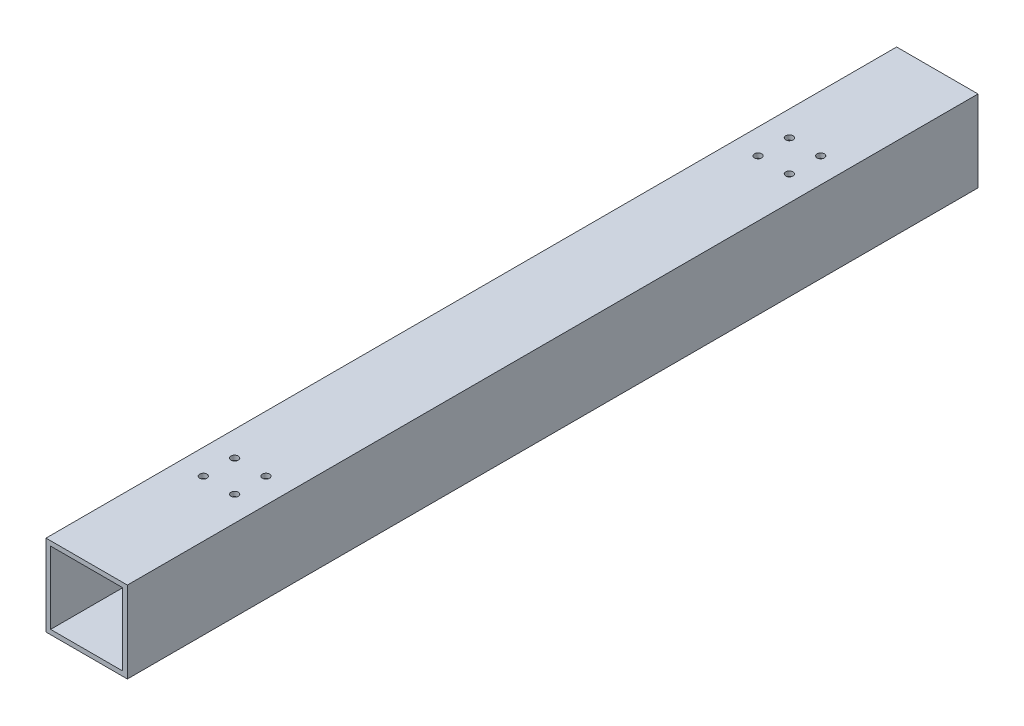
ISO-10303-21;
HEADER;
FILE_DESCRIPTION(('STEP AP214'),'2;1');
FILE_NAME('part.step','',(''),(''),'','','');
FILE_SCHEMA(('AUTOMOTIVE_DESIGN { 1 0 10303 214 1 1 1 1 }'));
ENDSEC;
DATA;
#1=APPLICATION_CONTEXT('core data for automotive mechanical design processes');
#2=APPLICATION_PROTOCOL_DEFINITION('international standard','automotive_design',2000,#1);
#3=PRODUCT_CONTEXT('',#1,'mechanical');
#4=PRODUCT('Part','Part','',(#3));
#5=PRODUCT_RELATED_PRODUCT_CATEGORY('part','',(#4));
#6=PRODUCT_DEFINITION_FORMATION('','',#4);
#7=PRODUCT_DEFINITION_CONTEXT('part definition',#1,'design');
#8=PRODUCT_DEFINITION('design','',#6,#7);
#9=PRODUCT_DEFINITION_SHAPE('','',#8);
#10=(LENGTH_UNIT() NAMED_UNIT(*) SI_UNIT(.MILLI.,.METRE.));
#11=(NAMED_UNIT(*) PLANE_ANGLE_UNIT() SI_UNIT($,.RADIAN.));
#12=(NAMED_UNIT(*) SI_UNIT($,.STERADIAN.) SOLID_ANGLE_UNIT());
#13=UNCERTAINTY_MEASURE_WITH_UNIT(LENGTH_MEASURE(1.E-05),#10,'distance_accuracy_value','');
#14=(GEOMETRIC_REPRESENTATION_CONTEXT(3) GLOBAL_UNCERTAINTY_ASSIGNED_CONTEXT((#13)) GLOBAL_UNIT_ASSIGNED_CONTEXT((#10,
#11,#12)) REPRESENTATION_CONTEXT('',''));
#15=CARTESIAN_POINT('',(0.,0.,0.));
#16=DIRECTION('',(0.,0.,1.));
#17=DIRECTION('',(1.,0.,0.));
#18=AXIS2_PLACEMENT_3D('',#15,#16,#17);
#19=CARTESIAN_POINT('',(0.,0.,182.5625));
#20=DIRECTION('',(0.,0.,-1.));
#21=DIRECTION('',(-1.,0.,0.));
#22=AXIS2_PLACEMENT_3D('',#19,#20,#21);
#23=PLANE('',#22);
#24=DIRECTION('',(0.,1.,0.));
#25=VECTOR('',#24,1.);
#26=CARTESIAN_POINT('',(17.4625,-17.4625,182.5625));
#27=LINE('',#26,#25);
#28=CARTESIAN_POINT('',(17.4625,-17.4625,182.5625));
#29=VERTEX_POINT('',#28);
#30=CARTESIAN_POINT('',(17.4625,17.4625,182.5625));
#31=VERTEX_POINT('',#30);
#32=EDGE_CURVE('E138',#29,#31,#27,.T.);
#33=ORIENTED_EDGE('',*,*,#32,.T.);
#34=DIRECTION('',(-1.,0.,0.));
#35=VECTOR('',#34,1.);
#36=CARTESIAN_POINT('',(-17.4625,17.4625,182.5625));
#37=LINE('',#36,#35);
#38=CARTESIAN_POINT('',(-17.4625,17.4625,182.5625));
#39=VERTEX_POINT('',#38);
#40=EDGE_CURVE('E141',#31,#39,#37,.T.);
#41=ORIENTED_EDGE('',*,*,#40,.T.);
#42=DIRECTION('',(0.,-1.,0.));
#43=VECTOR('',#42,1.);
#44=CARTESIAN_POINT('',(-17.4625,-17.4625,182.5625));
#45=LINE('',#44,#43);
#46=CARTESIAN_POINT('',(-17.4625,-17.4625,182.5625));
#47=VERTEX_POINT('',#46);
#48=EDGE_CURVE('E144',#39,#47,#45,.T.);
#49=ORIENTED_EDGE('',*,*,#48,.T.);
#50=DIRECTION('',(1.,0.,0.));
#51=VECTOR('',#50,1.);
#52=CARTESIAN_POINT('',(-17.4625,-17.4625,182.5625));
#53=LINE('',#52,#51);
#54=EDGE_CURVE('E146',#47,#29,#53,.T.);
#55=ORIENTED_EDGE('',*,*,#54,.T.);
#56=EDGE_LOOP('',(#33,#41,#49,#55));
#57=FACE_BOUND('',#56,.T.);
#58=DIRECTION('',(0.,1.,0.));
#59=VECTOR('',#58,1.);
#60=CARTESIAN_POINT('',(15.4813,-15.4813,182.5625));
#61=LINE('',#60,#59);
#62=CARTESIAN_POINT('',(15.4813,-15.4813,182.5625));
#63=VERTEX_POINT('',#62);
#64=CARTESIAN_POINT('',(15.4813,15.4813,182.5625));
#65=VERTEX_POINT('',#64);
#66=EDGE_CURVE('E100',#63,#65,#61,.T.);
#67=ORIENTED_EDGE('',*,*,#66,.F.);
#68=DIRECTION('',(1.,0.,0.));
#69=VECTOR('',#68,1.);
#70=CARTESIAN_POINT('',(-15.4813,-15.4813,182.5625));
#71=LINE('',#70,#69);
#72=CARTESIAN_POINT('',(-15.4813,-15.4813,182.5625));
#73=VERTEX_POINT('',#72);
#74=EDGE_CURVE('E122',#73,#63,#71,.T.);
#75=ORIENTED_EDGE('',*,*,#74,.F.);
#76=DIRECTION('',(0.,-1.,0.));
#77=VECTOR('',#76,1.);
#78=CARTESIAN_POINT('',(-15.4813,-15.4813,182.5625));
#79=LINE('',#78,#77);
#80=CARTESIAN_POINT('',(-15.4813,15.4813,182.5625));
#81=VERTEX_POINT('',#80);
#82=EDGE_CURVE('E120',#81,#73,#79,.T.);
#83=ORIENTED_EDGE('',*,*,#82,.F.);
#84=DIRECTION('',(-1.,0.,0.));
#85=VECTOR('',#84,1.);
#86=CARTESIAN_POINT('',(-15.4813,15.4813,182.5625));
#87=LINE('',#86,#85);
#88=EDGE_CURVE('E108',#65,#81,#87,.T.);
#89=ORIENTED_EDGE('',*,*,#88,.F.);
#90=EDGE_LOOP('',(#67,#75,#83,#89));
#91=FACE_BOUND('',#90,.T.);
#92=ADVANCED_FACE('F33',(#57,#91),#23,.F.);
#93=CARTESIAN_POINT('',(0.,0.,-182.5625));
#94=DIRECTION('',(0.,0.,-1.));
#95=DIRECTION('',(-1.,0.,0.));
#96=AXIS2_PLACEMENT_3D('',#93,#94,#95);
#97=PLANE('',#96);
#98=DIRECTION('',(0.,1.,0.));
#99=VECTOR('',#98,1.);
#100=CARTESIAN_POINT('',(17.4625,-17.4625,-182.5625));
#101=LINE('',#100,#99);
#102=CARTESIAN_POINT('',(17.4625,-17.4625,-182.5625));
#103=VERTEX_POINT('',#102);
#104=CARTESIAN_POINT('',(17.4625,17.4625,-182.5625));
#105=VERTEX_POINT('',#104);
#106=EDGE_CURVE('E116',#103,#105,#101,.T.);
#107=ORIENTED_EDGE('',*,*,#106,.F.);
#108=DIRECTION('',(1.,0.,0.));
#109=VECTOR('',#108,1.);
#110=CARTESIAN_POINT('',(-17.4625,-17.4625,-182.5625));
#111=LINE('',#110,#109);
#112=CARTESIAN_POINT('',(-17.4625,-17.4625,-182.5625));
#113=VERTEX_POINT('',#112);
#114=EDGE_CURVE('E142',#113,#103,#111,.T.);
#115=ORIENTED_EDGE('',*,*,#114,.F.);
#116=DIRECTION('',(0.,-1.,0.));
#117=VECTOR('',#116,1.);
#118=CARTESIAN_POINT('',(-17.4625,-17.4625,-182.5625));
#119=LINE('',#118,#117);
#120=CARTESIAN_POINT('',(-17.4625,17.4625,-182.5625));
#121=VERTEX_POINT('',#120);
#122=EDGE_CURVE('E153',#121,#113,#119,.T.);
#123=ORIENTED_EDGE('',*,*,#122,.F.);
#124=DIRECTION('',(-1.,0.,0.));
#125=VECTOR('',#124,1.);
#126=CARTESIAN_POINT('',(-17.4625,17.4625,-182.5625));
#127=LINE('',#126,#125);
#128=EDGE_CURVE('E151',#105,#121,#127,.T.);
#129=ORIENTED_EDGE('',*,*,#128,.F.);
#130=EDGE_LOOP('',(#107,#115,#123,#129));
#131=FACE_BOUND('',#130,.T.);
#132=DIRECTION('',(1.,0.,0.));
#133=VECTOR('',#132,1.);
#134=CARTESIAN_POINT('',(-15.4813,-15.4813,-182.5625));
#135=LINE('',#134,#133);
#136=CARTESIAN_POINT('',(-15.4813,-15.4813,-182.5625));
#137=VERTEX_POINT('',#136);
#138=CARTESIAN_POINT('',(15.4813,-15.4813,-182.5625));
#139=VERTEX_POINT('',#138);
#140=EDGE_CURVE('E109',#137,#139,#135,.T.);
#141=ORIENTED_EDGE('',*,*,#140,.T.);
#142=DIRECTION('',(0.,1.,0.));
#143=VECTOR('',#142,1.);
#144=CARTESIAN_POINT('',(15.4813,-15.4813,-182.5625));
#145=LINE('',#144,#143);
#146=CARTESIAN_POINT('',(15.4813,15.4813,-182.5625));
#147=VERTEX_POINT('',#146);
#148=EDGE_CURVE('E58',#139,#147,#145,.T.);
#149=ORIENTED_EDGE('',*,*,#148,.T.);
#150=DIRECTION('',(-1.,0.,0.));
#151=VECTOR('',#150,1.);
#152=CARTESIAN_POINT('',(-15.4813,15.4813,-182.5625));
#153=LINE('',#152,#151);
#154=CARTESIAN_POINT('',(-15.4813,15.4813,-182.5625));
#155=VERTEX_POINT('',#154);
#156=EDGE_CURVE('E115',#147,#155,#153,.T.);
#157=ORIENTED_EDGE('',*,*,#156,.T.);
#158=DIRECTION('',(0.,-1.,0.));
#159=VECTOR('',#158,1.);
#160=CARTESIAN_POINT('',(-15.4813,-15.4813,-182.5625));
#161=LINE('',#160,#159);
#162=EDGE_CURVE('E130',#155,#137,#161,.T.);
#163=ORIENTED_EDGE('',*,*,#162,.T.);
#164=EDGE_LOOP('',(#141,#149,#157,#163));
#165=FACE_BOUND('',#164,.T.);
#166=ADVANCED_FACE('F229',(#131,#165),#97,.T.);
#167=CARTESIAN_POINT('',(17.4625,-17.4625,182.5625));
#168=DIRECTION('',(-1.,0.,0.));
#169=DIRECTION('',(0.,0.,1.));
#170=AXIS2_PLACEMENT_3D('',#167,#168,#169);
#171=PLANE('',#170);
#172=ORIENTED_EDGE('',*,*,#106,.T.);
#173=DIRECTION('',(0.,0.,-1.));
#174=VECTOR('',#173,1.);
#175=CARTESIAN_POINT('',(17.4625,17.4625,182.5625));
#176=LINE('',#175,#174);
#177=EDGE_CURVE('E11',#31,#105,#176,.T.);
#178=ORIENTED_EDGE('',*,*,#177,.F.);
#179=ORIENTED_EDGE('',*,*,#32,.F.);
#180=DIRECTION('',(0.,0.,-1.));
#181=VECTOR('',#180,1.);
#182=CARTESIAN_POINT('',(17.4625,-17.4625,182.5625));
#183=LINE('',#182,#181);
#184=EDGE_CURVE('E148',#29,#103,#183,.T.);
#185=ORIENTED_EDGE('',*,*,#184,.T.);
#186=EDGE_LOOP('',(#172,#178,#179,#185));
#187=FACE_BOUND('',#186,.T.);
#188=ADVANCED_FACE('F35',(#187),#171,.F.);
#189=CARTESIAN_POINT('',(-17.4625,17.4625,182.5625));
#190=DIRECTION('',(0.,-1.,0.));
#191=DIRECTION('',(0.,0.,-1.));
#192=AXIS2_PLACEMENT_3D('',#189,#190,#191);
#193=PLANE('',#192);
#194=CARTESIAN_POINT('',(-6.71751442127231,17.4625,112.344985578728));
#195=DIRECTION('',(0.,1.,0.));
#196=DIRECTION('',(0.,0.,-1.));
#197=AXIS2_PLACEMENT_3D('',#194,#195,#196);
#198=CIRCLE('',#197,1.56250004999999);
#199=CARTESIAN_POINT('',(-6.71751442127231,17.4625,110.782485528728));
#200=VERTEX_POINT('',#199);
#201=EDGE_CURVE('E265',#200,#200,#198,.T.);
#202=ORIENTED_EDGE('',*,*,#201,.F.);
#203=EDGE_LOOP('',(#202));
#204=FACE_BOUND('',#203,.T.);
#205=CARTESIAN_POINT('',(-6.7175144212723,17.4625,-112.344985578728));
#206=DIRECTION('',(0.,1.,0.));
#207=DIRECTION('',(0.,0.,1.));
#208=AXIS2_PLACEMENT_3D('',#205,#206,#207);
#209=CIRCLE('',#208,1.56250005);
#210=CARTESIAN_POINT('',(-6.7175144212723,17.4625,-110.782485528728));
#211=VERTEX_POINT('',#210);
#212=EDGE_CURVE('E269',#211,#211,#209,.T.);
#213=ORIENTED_EDGE('',*,*,#212,.F.);
#214=EDGE_LOOP('',(#213));
#215=FACE_BOUND('',#214,.T.);
#216=CARTESIAN_POINT('',(6.71751442127208,17.4625,-112.344985578728));
#217=DIRECTION('',(0.,1.,0.));
#218=DIRECTION('',(0.,0.,1.));
#219=AXIS2_PLACEMENT_3D('',#216,#217,#218);
#220=CIRCLE('',#219,1.56250005000001);
#221=CARTESIAN_POINT('',(6.71751442127208,17.4625,-110.782485528728));
#222=VERTEX_POINT('',#221);
#223=EDGE_CURVE('E273',#222,#222,#220,.T.);
#224=ORIENTED_EDGE('',*,*,#223,.F.);
#225=EDGE_LOOP('',(#224));
#226=FACE_BOUND('',#225,.T.);
#227=CARTESIAN_POINT('',(-6.7175144212724,17.4625,-125.780014421272));
#228=DIRECTION('',(0.,1.,0.));
#229=DIRECTION('',(0.,0.,1.));
#230=AXIS2_PLACEMENT_3D('',#227,#228,#229);
#231=CIRCLE('',#230,1.56250005000002);
#232=CARTESIAN_POINT('',(-6.7175144212724,17.4625,-124.217514371272));
#233=VERTEX_POINT('',#232);
#234=EDGE_CURVE('E277',#233,#233,#231,.T.);
#235=ORIENTED_EDGE('',*,*,#234,.F.);
#236=EDGE_LOOP('',(#235));
#237=FACE_BOUND('',#236,.T.);
#238=CARTESIAN_POINT('',(6.71751442127208,17.4625,112.344985578728));
#239=DIRECTION('',(0.,1.,0.));
#240=DIRECTION('',(0.,0.,-1.));
#241=AXIS2_PLACEMENT_3D('',#238,#239,#240);
#242=CIRCLE('',#241,1.56250005000001);
#243=CARTESIAN_POINT('',(6.71751442127208,17.4625,110.782485528728));
#244=VERTEX_POINT('',#243);
#245=EDGE_CURVE('E281',#244,#244,#242,.T.);
#246=ORIENTED_EDGE('',*,*,#245,.F.);
#247=EDGE_LOOP('',(#246));
#248=FACE_BOUND('',#247,.T.);
#249=CARTESIAN_POINT('',(6.71751442127203,17.4625,125.780014421272));
#250=DIRECTION('',(0.,1.,0.));
#251=DIRECTION('',(0.,0.,-1.));
#252=AXIS2_PLACEMENT_3D('',#249,#250,#251);
#253=CIRCLE('',#252,1.56250004999998);
#254=CARTESIAN_POINT('',(6.71751442127203,17.4625,124.217514371272));
#255=VERTEX_POINT('',#254);
#256=EDGE_CURVE('E285',#255,#255,#253,.T.);
#257=ORIENTED_EDGE('',*,*,#256,.F.);
#258=EDGE_LOOP('',(#257));
#259=FACE_BOUND('',#258,.T.);
#260=CARTESIAN_POINT('',(-6.7175144212724,17.4625,125.780014421272));
#261=DIRECTION('',(0.,1.,0.));
#262=DIRECTION('',(0.,0.,-1.));
#263=AXIS2_PLACEMENT_3D('',#260,#261,#262);
#264=CIRCLE('',#263,1.56250005000002);
#265=CARTESIAN_POINT('',(-6.7175144212724,17.4625,124.217514371272));
#266=VERTEX_POINT('',#265);
#267=EDGE_CURVE('E289',#266,#266,#264,.T.);
#268=ORIENTED_EDGE('',*,*,#267,.F.);
#269=EDGE_LOOP('',(#268));
#270=FACE_BOUND('',#269,.T.);
#271=CARTESIAN_POINT('',(6.71751442127203,17.4625,-125.780014421272));
#272=DIRECTION('',(0.,1.,0.));
#273=DIRECTION('',(0.,0.,1.));
#274=AXIS2_PLACEMENT_3D('',#271,#272,#273);
#275=CIRCLE('',#274,1.56250004999999);
#276=CARTESIAN_POINT('',(6.71751442127203,17.4625,-124.217514371272));
#277=VERTEX_POINT('',#276);
#278=EDGE_CURVE('E293',#277,#277,#275,.T.);
#279=ORIENTED_EDGE('',*,*,#278,.F.);
#280=EDGE_LOOP('',(#279));
#281=FACE_BOUND('',#280,.T.);
#282=ORIENTED_EDGE('',*,*,#128,.T.);
#283=DIRECTION('',(0.,0.,-1.));
#284=VECTOR('',#283,1.);
#285=CARTESIAN_POINT('',(-17.4625,17.4625,182.5625));
#286=LINE('',#285,#284);
#287=EDGE_CURVE('E42',#39,#121,#286,.T.);
#288=ORIENTED_EDGE('',*,*,#287,.F.);
#289=ORIENTED_EDGE('',*,*,#40,.F.);
#290=ORIENTED_EDGE('',*,*,#177,.T.);
#291=EDGE_LOOP('',(#282,#288,#289,#290));
#292=FACE_BOUND('',#291,.T.);
#293=ADVANCED_FACE('F254',(#204,#215,#226,#237,#248,#259,#270,#281,#292),#193,.F.);
#294=CARTESIAN_POINT('',(-17.4625,-17.4625,182.5625));
#295=DIRECTION('',(1.,0.,0.));
#296=DIRECTION('',(0.,0.,-1.));
#297=AXIS2_PLACEMENT_3D('',#294,#295,#296);
#298=PLANE('',#297);
#299=ORIENTED_EDGE('',*,*,#122,.T.);
#300=DIRECTION('',(0.,0.,-1.));
#301=VECTOR('',#300,1.);
#302=CARTESIAN_POINT('',(-17.4625,-17.4625,182.5625));
#303=LINE('',#302,#301);
#304=EDGE_CURVE('E158',#47,#113,#303,.T.);
#305=ORIENTED_EDGE('',*,*,#304,.F.);
#306=ORIENTED_EDGE('',*,*,#48,.F.);
#307=ORIENTED_EDGE('',*,*,#287,.T.);
#308=EDGE_LOOP('',(#299,#305,#306,#307));
#309=FACE_BOUND('',#308,.T.);
#310=ADVANCED_FACE('F251',(#309),#298,.F.);
#311=CARTESIAN_POINT('',(-17.4625,-17.4625,182.5625));
#312=DIRECTION('',(0.,1.,0.));
#313=DIRECTION('',(0.,0.,1.));
#314=AXIS2_PLACEMENT_3D('',#311,#312,#313);
#315=PLANE('',#314);
#316=CARTESIAN_POINT('',(-6.71751442127231,-17.4625,112.344985578728));
#317=DIRECTION('',(0.,1.,0.));
#318=DIRECTION('',(0.,0.,-1.));
#319=AXIS2_PLACEMENT_3D('',#316,#317,#318);
#320=CIRCLE('',#319,1.56250004999999);
#321=CARTESIAN_POINT('',(-6.71751442127231,-17.4625,110.782485528728));
#322=VERTEX_POINT('',#321);
#323=EDGE_CURVE('E397',#322,#322,#320,.T.);
#324=ORIENTED_EDGE('',*,*,#323,.T.);
#325=EDGE_LOOP('',(#324));
#326=FACE_BOUND('',#325,.T.);
#327=CARTESIAN_POINT('',(-6.7175144212723,-17.4625,-112.344985578728));
#328=DIRECTION('',(0.,1.,0.));
#329=DIRECTION('',(0.,0.,1.));
#330=AXIS2_PLACEMENT_3D('',#327,#328,#329);
#331=CIRCLE('',#330,1.56250005);
#332=CARTESIAN_POINT('',(-6.7175144212723,-17.4625,-110.782485528728));
#333=VERTEX_POINT('',#332);
#334=EDGE_CURVE('E391',#333,#333,#331,.T.);
#335=ORIENTED_EDGE('',*,*,#334,.T.);
#336=EDGE_LOOP('',(#335));
#337=FACE_BOUND('',#336,.T.);
#338=CARTESIAN_POINT('',(6.71751442127208,-17.4625,-112.344985578728));
#339=DIRECTION('',(0.,1.,0.));
#340=DIRECTION('',(0.,0.,1.));
#341=AXIS2_PLACEMENT_3D('',#338,#339,#340);
#342=CIRCLE('',#341,1.56250005000001);
#343=CARTESIAN_POINT('',(6.71751442127208,-17.4625,-110.782485528728));
#344=VERTEX_POINT('',#343);
#345=EDGE_CURVE('E313',#344,#344,#342,.T.);
#346=ORIENTED_EDGE('',*,*,#345,.T.);
#347=EDGE_LOOP('',(#346));
#348=FACE_BOUND('',#347,.T.);
#349=CARTESIAN_POINT('',(-6.7175144212724,-17.4625,-125.780014421272));
#350=DIRECTION('',(0.,1.,0.));
#351=DIRECTION('',(0.,0.,1.));
#352=AXIS2_PLACEMENT_3D('',#349,#350,#351);
#353=CIRCLE('',#352,1.56250005000002);
#354=CARTESIAN_POINT('',(-6.7175144212724,-17.4625,-124.217514371272));
#355=VERTEX_POINT('',#354);
#356=EDGE_CURVE('E306',#355,#355,#353,.T.);
#357=ORIENTED_EDGE('',*,*,#356,.T.);
#358=EDGE_LOOP('',(#357));
#359=FACE_BOUND('',#358,.T.);
#360=CARTESIAN_POINT('',(6.71751442127208,-17.4625,112.344985578728));
#361=DIRECTION('',(0.,1.,0.));
#362=DIRECTION('',(0.,0.,-1.));
#363=AXIS2_PLACEMENT_3D('',#360,#361,#362);
#364=CIRCLE('',#363,1.56250005000001);
#365=CARTESIAN_POINT('',(6.71751442127208,-17.4625,110.782485528728));
#366=VERTEX_POINT('',#365);
#367=EDGE_CURVE('E400',#366,#366,#364,.T.);
#368=ORIENTED_EDGE('',*,*,#367,.T.);
#369=EDGE_LOOP('',(#368));
#370=FACE_BOUND('',#369,.T.);
#371=CARTESIAN_POINT('',(6.71751442127203,-17.4625,125.780014421272));
#372=DIRECTION('',(0.,1.,0.));
#373=DIRECTION('',(0.,0.,-1.));
#374=AXIS2_PLACEMENT_3D('',#371,#372,#373);
#375=CIRCLE('',#374,1.56250004999998);
#376=CARTESIAN_POINT('',(6.71751442127203,-17.4625,124.217514371272));
#377=VERTEX_POINT('',#376);
#378=EDGE_CURVE('E407',#377,#377,#375,.T.);
#379=ORIENTED_EDGE('',*,*,#378,.T.);
#380=EDGE_LOOP('',(#379));
#381=FACE_BOUND('',#380,.T.);
#382=CARTESIAN_POINT('',(-6.7175144212724,-17.4625,125.780014421272));
#383=DIRECTION('',(0.,1.,0.));
#384=DIRECTION('',(0.,0.,-1.));
#385=AXIS2_PLACEMENT_3D('',#382,#383,#384);
#386=CIRCLE('',#385,1.56250005000002);
#387=CARTESIAN_POINT('',(-6.7175144212724,-17.4625,124.217514371272));
#388=VERTEX_POINT('',#387);
#389=EDGE_CURVE('E403',#388,#388,#386,.T.);
#390=ORIENTED_EDGE('',*,*,#389,.T.);
#391=EDGE_LOOP('',(#390));
#392=FACE_BOUND('',#391,.T.);
#393=CARTESIAN_POINT('',(6.71751442127203,-17.4625,-125.780014421272));
#394=DIRECTION('',(0.,1.,0.));
#395=DIRECTION('',(0.,0.,1.));
#396=AXIS2_PLACEMENT_3D('',#393,#394,#395);
#397=CIRCLE('',#396,1.56250004999999);
#398=CARTESIAN_POINT('',(6.71751442127203,-17.4625,-124.217514371272));
#399=VERTEX_POINT('',#398);
#400=EDGE_CURVE('E167',#399,#399,#397,.T.);
#401=ORIENTED_EDGE('',*,*,#400,.T.);
#402=EDGE_LOOP('',(#401));
#403=FACE_BOUND('',#402,.T.);
#404=ORIENTED_EDGE('',*,*,#114,.T.);
#405=ORIENTED_EDGE('',*,*,#184,.F.);
#406=ORIENTED_EDGE('',*,*,#54,.F.);
#407=ORIENTED_EDGE('',*,*,#304,.T.);
#408=EDGE_LOOP('',(#404,#405,#406,#407));
#409=FACE_BOUND('',#408,.T.);
#410=ADVANCED_FACE('F248',(#326,#337,#348,#359,#370,#381,#392,#403,#409),#315,.F.);
#411=CARTESIAN_POINT('',(15.4813,-15.4813,182.5625));
#412=DIRECTION('',(-1.,0.,0.));
#413=DIRECTION('',(0.,0.,1.));
#414=AXIS2_PLACEMENT_3D('',#411,#412,#413);
#415=PLANE('',#414);
#416=ORIENTED_EDGE('',*,*,#148,.F.);
#417=DIRECTION('',(0.,0.,-1.));
#418=VECTOR('',#417,1.);
#419=CARTESIAN_POINT('',(15.4813,-15.4813,182.5625));
#420=LINE('',#419,#418);
#421=EDGE_CURVE('E104',#63,#139,#420,.T.);
#422=ORIENTED_EDGE('',*,*,#421,.F.);
#423=ORIENTED_EDGE('',*,*,#66,.T.);
#424=DIRECTION('',(0.,0.,-1.));
#425=VECTOR('',#424,1.);
#426=CARTESIAN_POINT('',(15.4813,15.4813,182.5625));
#427=LINE('',#426,#425);
#428=EDGE_CURVE('E103',#65,#147,#427,.T.);
#429=ORIENTED_EDGE('',*,*,#428,.T.);
#430=EDGE_LOOP('',(#416,#422,#423,#429));
#431=FACE_BOUND('',#430,.T.);
#432=ADVANCED_FACE('F102',(#431),#415,.T.);
#433=CARTESIAN_POINT('',(-15.4813,15.4813,182.5625));
#434=DIRECTION('',(0.,-1.,0.));
#435=DIRECTION('',(1.,0.,0.));
#436=AXIS2_PLACEMENT_3D('',#433,#434,#435);
#437=PLANE('',#436);
#438=CARTESIAN_POINT('',(-6.71751442127231,15.4813,112.344985578728));
#439=DIRECTION('',(0.,-1.,0.));
#440=DIRECTION('',(1.,0.,0.));
#441=AXIS2_PLACEMENT_3D('',#438,#439,#440);
#442=CIRCLE('',#441,1.56250004999999);
#443=CARTESIAN_POINT('',(-5.15501437127231,15.4813,112.344985578728));
#444=VERTEX_POINT('',#443);
#445=EDGE_CURVE('E128',#444,#444,#442,.T.);
#446=ORIENTED_EDGE('',*,*,#445,.F.);
#447=EDGE_LOOP('',(#446));
#448=FACE_BOUND('',#447,.T.);
#449=CARTESIAN_POINT('',(-6.7175144212723,15.4813,-112.344985578728));
#450=DIRECTION('',(0.,-1.,0.));
#451=DIRECTION('',(1.,0.,0.));
#452=AXIS2_PLACEMENT_3D('',#449,#450,#451);
#453=CIRCLE('',#452,1.56250005);
#454=CARTESIAN_POINT('',(-5.15501437127231,15.4813,-112.344985578728));
#455=VERTEX_POINT('',#454);
#456=EDGE_CURVE('E189',#455,#455,#453,.T.);
#457=ORIENTED_EDGE('',*,*,#456,.F.);
#458=EDGE_LOOP('',(#457));
#459=FACE_BOUND('',#458,.T.);
#460=CARTESIAN_POINT('',(6.71751442127208,15.4813,-112.344985578728));
#461=DIRECTION('',(0.,-1.,0.));
#462=DIRECTION('',(1.,0.,0.));
#463=AXIS2_PLACEMENT_3D('',#460,#461,#462);
#464=CIRCLE('',#463,1.56250005000001);
#465=CARTESIAN_POINT('',(8.28001447127208,15.4813,-112.344985578728));
#466=VERTEX_POINT('',#465);
#467=EDGE_CURVE('E186',#466,#466,#464,.T.);
#468=ORIENTED_EDGE('',*,*,#467,.F.);
#469=EDGE_LOOP('',(#468));
#470=FACE_BOUND('',#469,.T.);
#471=CARTESIAN_POINT('',(-6.7175144212724,15.4813,-125.780014421272));
#472=DIRECTION('',(0.,-1.,0.));
#473=DIRECTION('',(1.,0.,0.));
#474=AXIS2_PLACEMENT_3D('',#471,#472,#473);
#475=CIRCLE('',#474,1.56250005000002);
#476=CARTESIAN_POINT('',(-5.15501437127238,15.4813,-125.780014421272));
#477=VERTEX_POINT('',#476);
#478=EDGE_CURVE('E183',#477,#477,#475,.T.);
#479=ORIENTED_EDGE('',*,*,#478,.F.);
#480=EDGE_LOOP('',(#479));
#481=FACE_BOUND('',#480,.T.);
#482=CARTESIAN_POINT('',(6.71751442127208,15.4813,112.344985578728));
#483=DIRECTION('',(0.,-1.,0.));
#484=DIRECTION('',(1.,0.,0.));
#485=AXIS2_PLACEMENT_3D('',#482,#483,#484);
#486=CIRCLE('',#485,1.56250005000001);
#487=CARTESIAN_POINT('',(8.28001447127209,15.4813,112.344985578728));
#488=VERTEX_POINT('',#487);
#489=EDGE_CURVE('E179',#488,#488,#486,.T.);
#490=ORIENTED_EDGE('',*,*,#489,.F.);
#491=EDGE_LOOP('',(#490));
#492=FACE_BOUND('',#491,.T.);
#493=CARTESIAN_POINT('',(6.71751442127203,15.4813,125.780014421272));
#494=DIRECTION('',(0.,-1.,0.));
#495=DIRECTION('',(1.,0.,0.));
#496=AXIS2_PLACEMENT_3D('',#493,#494,#495);
#497=CIRCLE('',#496,1.56250004999998);
#498=CARTESIAN_POINT('',(8.28001447127201,15.4813,125.780014421272));
#499=VERTEX_POINT('',#498);
#500=EDGE_CURVE('E175',#499,#499,#497,.T.);
#501=ORIENTED_EDGE('',*,*,#500,.F.);
#502=EDGE_LOOP('',(#501));
#503=FACE_BOUND('',#502,.T.);
#504=CARTESIAN_POINT('',(-6.7175144212724,15.4813,125.780014421272));
#505=DIRECTION('',(0.,-1.,0.));
#506=DIRECTION('',(1.,0.,0.));
#507=AXIS2_PLACEMENT_3D('',#504,#505,#506);
#508=CIRCLE('',#507,1.56250005000002);
#509=CARTESIAN_POINT('',(-5.15501437127238,15.4813,125.780014421272));
#510=VERTEX_POINT('',#509);
#511=EDGE_CURVE('E171',#510,#510,#508,.T.);
#512=ORIENTED_EDGE('',*,*,#511,.F.);
#513=EDGE_LOOP('',(#512));
#514=FACE_BOUND('',#513,.T.);
#515=CARTESIAN_POINT('',(6.71751442127203,15.4813,-125.780014421272));
#516=DIRECTION('',(0.,-1.,0.));
#517=DIRECTION('',(1.,0.,0.));
#518=AXIS2_PLACEMENT_3D('',#515,#516,#517);
#519=CIRCLE('',#518,1.56250004999999);
#520=CARTESIAN_POINT('',(8.28001447127201,15.4813,-125.780014421272));
#521=VERTEX_POINT('',#520);
#522=EDGE_CURVE('E166',#521,#521,#519,.T.);
#523=ORIENTED_EDGE('',*,*,#522,.F.);
#524=EDGE_LOOP('',(#523));
#525=FACE_BOUND('',#524,.T.);
#526=ORIENTED_EDGE('',*,*,#156,.F.);
#527=ORIENTED_EDGE('',*,*,#428,.F.);
#528=ORIENTED_EDGE('',*,*,#88,.T.);
#529=DIRECTION('',(0.,0.,-1.));
#530=VECTOR('',#529,1.);
#531=CARTESIAN_POINT('',(-15.4813,15.4813,182.5625));
#532=LINE('',#531,#530);
#533=EDGE_CURVE('E117',#81,#155,#532,.T.);
#534=ORIENTED_EDGE('',*,*,#533,.T.);
#535=EDGE_LOOP('',(#526,#527,#528,#534));
#536=FACE_BOUND('',#535,.T.);
#537=ADVANCED_FACE('F112',(#448,#459,#470,#481,#492,#503,#514,#525,#536),#437,.T.);
#538=CARTESIAN_POINT('',(-15.4813,-15.4813,182.5625));
#539=DIRECTION('',(1.,0.,0.));
#540=DIRECTION('',(0.,0.,-1.));
#541=AXIS2_PLACEMENT_3D('',#538,#539,#540);
#542=PLANE('',#541);
#543=ORIENTED_EDGE('',*,*,#162,.F.);
#544=ORIENTED_EDGE('',*,*,#533,.F.);
#545=ORIENTED_EDGE('',*,*,#82,.T.);
#546=DIRECTION('',(0.,0.,-1.));
#547=VECTOR('',#546,1.);
#548=CARTESIAN_POINT('',(-15.4813,-15.4813,182.5625));
#549=LINE('',#548,#547);
#550=EDGE_CURVE('E50',#73,#137,#549,.T.);
#551=ORIENTED_EDGE('',*,*,#550,.T.);
#552=EDGE_LOOP('',(#543,#544,#545,#551));
#553=FACE_BOUND('',#552,.T.);
#554=ADVANCED_FACE('F213',(#553),#542,.T.);
#555=CARTESIAN_POINT('',(-15.4813,-15.4813,182.5625));
#556=DIRECTION('',(0.,1.,0.));
#557=DIRECTION('',(0.,0.,1.));
#558=AXIS2_PLACEMENT_3D('',#555,#556,#557);
#559=PLANE('',#558);
#560=CARTESIAN_POINT('',(-6.71751442127231,-15.4813,112.344985578728));
#561=DIRECTION('',(0.,1.,0.));
#562=DIRECTION('',(0.,0.,1.));
#563=AXIS2_PLACEMENT_3D('',#560,#561,#562);
#564=CIRCLE('',#563,1.56250004999999);
#565=CARTESIAN_POINT('',(-6.71751442127231,-15.4813,113.907485628728));
#566=VERTEX_POINT('',#565);
#567=EDGE_CURVE('E37',#566,#566,#564,.T.);
#568=ORIENTED_EDGE('',*,*,#567,.F.);
#569=EDGE_LOOP('',(#568));
#570=FACE_BOUND('',#569,.T.);
#571=CARTESIAN_POINT('',(-6.7175144212723,-15.4813,-112.344985578728));
#572=DIRECTION('',(0.,1.,0.));
#573=DIRECTION('',(0.,0.,1.));
#574=AXIS2_PLACEMENT_3D('',#571,#572,#573);
#575=CIRCLE('',#574,1.56250005);
#576=CARTESIAN_POINT('',(-6.7175144212723,-15.4813,-110.782485528728));
#577=VERTEX_POINT('',#576);
#578=EDGE_CURVE('E187',#577,#577,#575,.T.);
#579=ORIENTED_EDGE('',*,*,#578,.F.);
#580=EDGE_LOOP('',(#579));
#581=FACE_BOUND('',#580,.T.);
#582=CARTESIAN_POINT('',(6.71751442127208,-15.4813,-112.344985578728));
#583=DIRECTION('',(0.,1.,0.));
#584=DIRECTION('',(0.,0.,1.));
#585=AXIS2_PLACEMENT_3D('',#582,#583,#584);
#586=CIRCLE('',#585,1.56250005000001);
#587=CARTESIAN_POINT('',(6.71751442127208,-15.4813,-110.782485528728));
#588=VERTEX_POINT('',#587);
#589=EDGE_CURVE('E184',#588,#588,#586,.T.);
#590=ORIENTED_EDGE('',*,*,#589,.F.);
#591=EDGE_LOOP('',(#590));
#592=FACE_BOUND('',#591,.T.);
#593=CARTESIAN_POINT('',(-6.7175144212724,-15.4813,-125.780014421272));
#594=DIRECTION('',(0.,1.,0.));
#595=DIRECTION('',(0.,0.,1.));
#596=AXIS2_PLACEMENT_3D('',#593,#594,#595);
#597=CIRCLE('',#596,1.56250005000002);
#598=CARTESIAN_POINT('',(-6.7175144212724,-15.4813,-124.217514371272));
#599=VERTEX_POINT('',#598);
#600=EDGE_CURVE('E180',#599,#599,#597,.T.);
#601=ORIENTED_EDGE('',*,*,#600,.F.);
#602=EDGE_LOOP('',(#601));
#603=FACE_BOUND('',#602,.T.);
#604=CARTESIAN_POINT('',(6.71751442127208,-15.4813,112.344985578728));
#605=DIRECTION('',(0.,1.,0.));
#606=DIRECTION('',(0.,0.,1.));
#607=AXIS2_PLACEMENT_3D('',#604,#605,#606);
#608=CIRCLE('',#607,1.56250005000001);
#609=CARTESIAN_POINT('',(6.71751442127208,-15.4813,113.907485628728));
#610=VERTEX_POINT('',#609);
#611=EDGE_CURVE('E176',#610,#610,#608,.T.);
#612=ORIENTED_EDGE('',*,*,#611,.F.);
#613=EDGE_LOOP('',(#612));
#614=FACE_BOUND('',#613,.T.);
#615=CARTESIAN_POINT('',(6.71751442127203,-15.4813,125.780014421272));
#616=DIRECTION('',(0.,1.,0.));
#617=DIRECTION('',(0.,0.,1.));
#618=AXIS2_PLACEMENT_3D('',#615,#616,#617);
#619=CIRCLE('',#618,1.56250004999998);
#620=CARTESIAN_POINT('',(6.71751442127203,-15.4813,127.342514471272));
#621=VERTEX_POINT('',#620);
#622=EDGE_CURVE('E172',#621,#621,#619,.T.);
#623=ORIENTED_EDGE('',*,*,#622,.F.);
#624=EDGE_LOOP('',(#623));
#625=FACE_BOUND('',#624,.T.);
#626=CARTESIAN_POINT('',(-6.7175144212724,-15.4813,125.780014421272));
#627=DIRECTION('',(0.,1.,0.));
#628=DIRECTION('',(0.,0.,1.));
#629=AXIS2_PLACEMENT_3D('',#626,#627,#628);
#630=CIRCLE('',#629,1.56250005000002);
#631=CARTESIAN_POINT('',(-6.7175144212724,-15.4813,127.342514471272));
#632=VERTEX_POINT('',#631);
#633=EDGE_CURVE('E168',#632,#632,#630,.T.);
#634=ORIENTED_EDGE('',*,*,#633,.F.);
#635=EDGE_LOOP('',(#634));
#636=FACE_BOUND('',#635,.T.);
#637=CARTESIAN_POINT('',(6.71751442127203,-15.4813,-125.780014421272));
#638=DIRECTION('',(0.,1.,0.));
#639=DIRECTION('',(0.,0.,1.));
#640=AXIS2_PLACEMENT_3D('',#637,#638,#639);
#641=CIRCLE('',#640,1.56250004999999);
#642=CARTESIAN_POINT('',(6.71751442127203,-15.4813,-124.217514371272));
#643=VERTEX_POINT('',#642);
#644=EDGE_CURVE('E163',#643,#643,#641,.T.);
#645=ORIENTED_EDGE('',*,*,#644,.F.);
#646=EDGE_LOOP('',(#645));
#647=FACE_BOUND('',#646,.T.);
#648=ORIENTED_EDGE('',*,*,#140,.F.);
#649=ORIENTED_EDGE('',*,*,#550,.F.);
#650=ORIENTED_EDGE('',*,*,#74,.T.);
#651=ORIENTED_EDGE('',*,*,#421,.T.);
#652=EDGE_LOOP('',(#648,#649,#650,#651));
#653=FACE_BOUND('',#652,.T.);
#654=ADVANCED_FACE('F209',(#570,#581,#592,#603,#614,#625,#636,#647,#653),#559,.T.);
#655=CARTESIAN_POINT('',(6.71751442127203,-17.4625,-125.780014421272));
#656=DIRECTION('',(0.,1.,0.));
#657=DIRECTION('',(0.,0.,1.));
#658=AXIS2_PLACEMENT_3D('',#655,#656,#657);
#659=CYLINDRICAL_SURFACE('',#658,1.56250004999999);
#660=ORIENTED_EDGE('',*,*,#644,.T.);
#661=EDGE_LOOP('',(#660));
#662=FACE_BOUND('',#661,.T.);
#663=ORIENTED_EDGE('',*,*,#400,.F.);
#664=EDGE_LOOP('',(#663));
#665=FACE_BOUND('',#664,.T.);
#666=ADVANCED_FACE('F212',(#662,#665),#659,.F.);
#667=CARTESIAN_POINT('',(-6.7175144212724,-17.4625,125.780014421272));
#668=DIRECTION('',(0.,1.,0.));
#669=DIRECTION('',(0.,0.,1.));
#670=AXIS2_PLACEMENT_3D('',#667,#668,#669);
#671=CYLINDRICAL_SURFACE('',#670,1.56250005000002);
#672=ORIENTED_EDGE('',*,*,#633,.T.);
#673=EDGE_LOOP('',(#672));
#674=FACE_BOUND('',#673,.T.);
#675=ORIENTED_EDGE('',*,*,#389,.F.);
#676=EDGE_LOOP('',(#675));
#677=FACE_BOUND('',#676,.T.);
#678=ADVANCED_FACE('F345',(#674,#677),#671,.F.);
#679=CARTESIAN_POINT('',(6.71751442127203,-17.4625,125.780014421272));
#680=DIRECTION('',(0.,1.,0.));
#681=DIRECTION('',(0.,0.,1.));
#682=AXIS2_PLACEMENT_3D('',#679,#680,#681);
#683=CYLINDRICAL_SURFACE('',#682,1.56250004999998);
#684=ORIENTED_EDGE('',*,*,#622,.T.);
#685=EDGE_LOOP('',(#684));
#686=FACE_BOUND('',#685,.T.);
#687=ORIENTED_EDGE('',*,*,#378,.F.);
#688=EDGE_LOOP('',(#687));
#689=FACE_BOUND('',#688,.T.);
#690=ADVANCED_FACE('F355',(#686,#689),#683,.F.);
#691=CARTESIAN_POINT('',(6.71751442127208,-17.4625,112.344985578728));
#692=DIRECTION('',(0.,1.,0.));
#693=DIRECTION('',(0.,0.,1.));
#694=AXIS2_PLACEMENT_3D('',#691,#692,#693);
#695=CYLINDRICAL_SURFACE('',#694,1.56250005000001);
#696=ORIENTED_EDGE('',*,*,#611,.T.);
#697=EDGE_LOOP('',(#696));
#698=FACE_BOUND('',#697,.T.);
#699=ORIENTED_EDGE('',*,*,#367,.F.);
#700=EDGE_LOOP('',(#699));
#701=FACE_BOUND('',#700,.T.);
#702=ADVANCED_FACE('F363',(#698,#701),#695,.F.);
#703=CARTESIAN_POINT('',(-6.7175144212724,-17.4625,-125.780014421272));
#704=DIRECTION('',(0.,1.,0.));
#705=DIRECTION('',(0.,0.,1.));
#706=AXIS2_PLACEMENT_3D('',#703,#704,#705);
#707=CYLINDRICAL_SURFACE('',#706,1.56250005000002);
#708=ORIENTED_EDGE('',*,*,#600,.T.);
#709=EDGE_LOOP('',(#708));
#710=FACE_BOUND('',#709,.T.);
#711=ORIENTED_EDGE('',*,*,#356,.F.);
#712=EDGE_LOOP('',(#711));
#713=FACE_BOUND('',#712,.T.);
#714=ADVANCED_FACE('F373',(#710,#713),#707,.F.);
#715=CARTESIAN_POINT('',(6.71751442127208,-17.4625,-112.344985578728));
#716=DIRECTION('',(0.,1.,0.));
#717=DIRECTION('',(0.,0.,1.));
#718=AXIS2_PLACEMENT_3D('',#715,#716,#717);
#719=CYLINDRICAL_SURFACE('',#718,1.56250005000001);
#720=ORIENTED_EDGE('',*,*,#589,.T.);
#721=EDGE_LOOP('',(#720));
#722=FACE_BOUND('',#721,.T.);
#723=ORIENTED_EDGE('',*,*,#345,.F.);
#724=EDGE_LOOP('',(#723));
#725=FACE_BOUND('',#724,.T.);
#726=ADVANCED_FACE('F370',(#722,#725),#719,.F.);
#727=CARTESIAN_POINT('',(-6.7175144212723,-17.4625,-112.344985578728));
#728=DIRECTION('',(0.,1.,0.));
#729=DIRECTION('',(0.,0.,1.));
#730=AXIS2_PLACEMENT_3D('',#727,#728,#729);
#731=CYLINDRICAL_SURFACE('',#730,1.56250005);
#732=ORIENTED_EDGE('',*,*,#578,.T.);
#733=EDGE_LOOP('',(#732));
#734=FACE_BOUND('',#733,.T.);
#735=ORIENTED_EDGE('',*,*,#334,.F.);
#736=EDGE_LOOP('',(#735));
#737=FACE_BOUND('',#736,.T.);
#738=ADVANCED_FACE('F346',(#734,#737),#731,.F.);
#739=CARTESIAN_POINT('',(-6.71751442127231,-17.4625,112.344985578728));
#740=DIRECTION('',(0.,1.,0.));
#741=DIRECTION('',(0.,0.,1.));
#742=AXIS2_PLACEMENT_3D('',#739,#740,#741);
#743=CYLINDRICAL_SURFACE('',#742,1.56250004999999);
#744=ORIENTED_EDGE('',*,*,#567,.T.);
#745=EDGE_LOOP('',(#744));
#746=FACE_BOUND('',#745,.T.);
#747=ORIENTED_EDGE('',*,*,#323,.F.);
#748=EDGE_LOOP('',(#747));
#749=FACE_BOUND('',#748,.T.);
#750=ADVANCED_FACE('F206',(#746,#749),#743,.F.);
#751=ORIENTED_EDGE('',*,*,#522,.T.);
#752=EDGE_LOOP('',(#751));
#753=FACE_BOUND('',#752,.T.);
#754=ORIENTED_EDGE('',*,*,#278,.T.);
#755=EDGE_LOOP('',(#754));
#756=FACE_BOUND('',#755,.T.);
#757=ADVANCED_FACE('F334',(#753,#756),#659,.F.);
#758=ORIENTED_EDGE('',*,*,#511,.T.);
#759=EDGE_LOOP('',(#758));
#760=FACE_BOUND('',#759,.T.);
#761=ORIENTED_EDGE('',*,*,#267,.T.);
#762=EDGE_LOOP('',(#761));
#763=FACE_BOUND('',#762,.T.);
#764=ADVANCED_FACE('F336',(#760,#763),#671,.F.);
#765=ORIENTED_EDGE('',*,*,#500,.T.);
#766=EDGE_LOOP('',(#765));
#767=FACE_BOUND('',#766,.T.);
#768=ORIENTED_EDGE('',*,*,#256,.T.);
#769=EDGE_LOOP('',(#768));
#770=FACE_BOUND('',#769,.T.);
#771=ADVANCED_FACE('F342',(#767,#770),#683,.F.);
#772=ORIENTED_EDGE('',*,*,#489,.T.);
#773=EDGE_LOOP('',(#772));
#774=FACE_BOUND('',#773,.T.);
#775=ORIENTED_EDGE('',*,*,#245,.T.);
#776=EDGE_LOOP('',(#775));
#777=FACE_BOUND('',#776,.T.);
#778=ADVANCED_FACE('F324',(#774,#777),#695,.F.);
#779=ORIENTED_EDGE('',*,*,#478,.T.);
#780=EDGE_LOOP('',(#779));
#781=FACE_BOUND('',#780,.T.);
#782=ORIENTED_EDGE('',*,*,#234,.T.);
#783=EDGE_LOOP('',(#782));
#784=FACE_BOUND('',#783,.T.);
#785=ADVANCED_FACE('F376',(#781,#784),#707,.F.);
#786=ORIENTED_EDGE('',*,*,#467,.T.);
#787=EDGE_LOOP('',(#786));
#788=FACE_BOUND('',#787,.T.);
#789=ORIENTED_EDGE('',*,*,#223,.T.);
#790=EDGE_LOOP('',(#789));
#791=FACE_BOUND('',#790,.T.);
#792=ADVANCED_FACE('F379',(#788,#791),#719,.F.);
#793=ORIENTED_EDGE('',*,*,#456,.T.);
#794=EDGE_LOOP('',(#793));
#795=FACE_BOUND('',#794,.T.);
#796=ORIENTED_EDGE('',*,*,#212,.T.);
#797=EDGE_LOOP('',(#796));
#798=FACE_BOUND('',#797,.T.);
#799=ADVANCED_FACE('F371',(#795,#798),#731,.F.);
#800=ORIENTED_EDGE('',*,*,#445,.T.);
#801=EDGE_LOOP('',(#800));
#802=FACE_BOUND('',#801,.T.);
#803=ORIENTED_EDGE('',*,*,#201,.T.);
#804=EDGE_LOOP('',(#803));
#805=FACE_BOUND('',#804,.T.);
#806=ADVANCED_FACE('F348',(#802,#805),#743,.F.);
#807=CLOSED_SHELL('',(#92,#166,#188,#293,#310,#410,#432,#537,#554,#654,#666,#678,#690,#702,#714,
#726,#738,#750,#757,#764,#771,#778,#785,#792,#799,#806));
#808=MANIFOLD_SOLID_BREP('B2',#807);
#809=ADVANCED_BREP_SHAPE_REPRESENTATION('',(#18,#808),#14);
#810=SHAPE_DEFINITION_REPRESENTATION(#9,#809);
ENDSEC;
END-ISO-10303-21;
